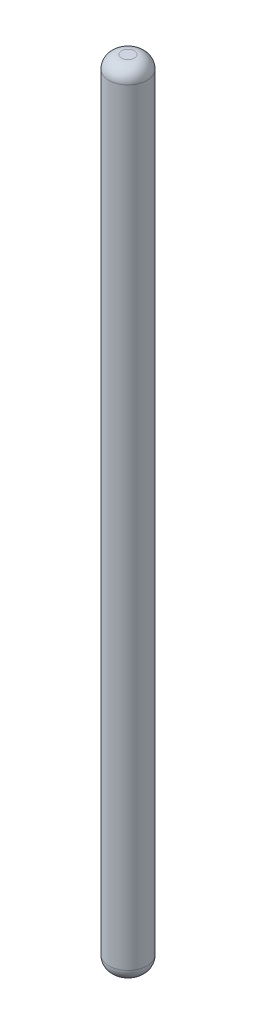
ISO-10303-21;
HEADER;
FILE_DESCRIPTION(('STEP AP214'),'2;1');
FILE_NAME('part.step','',(''),(''),'','','');
FILE_SCHEMA(('AUTOMOTIVE_DESIGN { 1 0 10303 214 1 1 1 1 }'));
ENDSEC;
DATA;
#1=APPLICATION_CONTEXT('core data for automotive mechanical design processes');
#2=APPLICATION_PROTOCOL_DEFINITION('international standard','automotive_design',2000,#1);
#3=PRODUCT_CONTEXT('',#1,'mechanical');
#4=PRODUCT('Part','Part','',(#3));
#5=PRODUCT_RELATED_PRODUCT_CATEGORY('part','',(#4));
#6=PRODUCT_DEFINITION_FORMATION('','',#4);
#7=PRODUCT_DEFINITION_CONTEXT('part definition',#1,'design');
#8=PRODUCT_DEFINITION('design','',#6,#7);
#9=PRODUCT_DEFINITION_SHAPE('','',#8);
#10=(LENGTH_UNIT() NAMED_UNIT(*) SI_UNIT(.MILLI.,.METRE.));
#11=(NAMED_UNIT(*) PLANE_ANGLE_UNIT() SI_UNIT($,.RADIAN.));
#12=(NAMED_UNIT(*) SI_UNIT($,.STERADIAN.) SOLID_ANGLE_UNIT());
#13=UNCERTAINTY_MEASURE_WITH_UNIT(LENGTH_MEASURE(1.E-05),#10,'distance_accuracy_value','');
#14=(GEOMETRIC_REPRESENTATION_CONTEXT(3) GLOBAL_UNCERTAINTY_ASSIGNED_CONTEXT((#13)) GLOBAL_UNIT_ASSIGNED_CONTEXT((#10,
#11,#12)) REPRESENTATION_CONTEXT('',''));
#15=CARTESIAN_POINT('',(0.,0.,0.));
#16=DIRECTION('',(0.,0.,1.));
#17=DIRECTION('',(1.,0.,0.));
#18=AXIS2_PLACEMENT_3D('',#15,#16,#17);
#19=CARTESIAN_POINT('',(0.,62.,0.));
#20=DIRECTION('',(0.,-1.,0.));
#21=DIRECTION('',(0.,0.,-1.));
#22=AXIS2_PLACEMENT_3D('',#19,#20,#21);
#23=CYLINDRICAL_SURFACE('',#22,1.5);
#24=CARTESIAN_POINT('',(0.,1.,0.));
#25=DIRECTION('',(0.,1.,0.));
#26=DIRECTION('',(0.,0.,1.));
#27=AXIS2_PLACEMENT_3D('',#24,#25,#26);
#28=CIRCLE('',#27,1.5);
#29=CARTESIAN_POINT('',(0.,1.,1.5));
#30=VERTEX_POINT('',#29);
#31=EDGE_CURVE('E43',#30,#30,#28,.T.);
#32=ORIENTED_EDGE('',*,*,#31,.T.);
#33=EDGE_LOOP('',(#32));
#34=FACE_BOUND('',#33,.T.);
#35=CARTESIAN_POINT('',(0.,61.,0.));
#36=DIRECTION('',(0.,1.,0.));
#37=DIRECTION('',(0.,0.,1.));
#38=AXIS2_PLACEMENT_3D('',#35,#36,#37);
#39=CIRCLE('',#38,1.5);
#40=CARTESIAN_POINT('',(0.,61.,1.5));
#41=VERTEX_POINT('',#40);
#42=EDGE_CURVE('E47',#41,#41,#39,.F.);
#43=ORIENTED_EDGE('',*,*,#42,.T.);
#44=EDGE_LOOP('',(#43));
#45=FACE_BOUND('',#44,.T.);
#46=ADVANCED_FACE('F32',(#34,#45),#23,.T.);
#47=CARTESIAN_POINT('',(0.,62.,0.));
#48=DIRECTION('',(0.,1.,0.));
#49=DIRECTION('',(0.,0.,1.));
#50=AXIS2_PLACEMENT_3D('',#47,#48,#49);
#51=PLANE('',#50);
#52=CARTESIAN_POINT('',(0.,62.,0.));
#53=DIRECTION('',(0.,1.,0.));
#54=DIRECTION('',(0.,0.,1.));
#55=AXIS2_PLACEMENT_3D('',#52,#53,#54);
#56=CIRCLE('',#55,0.5);
#57=CARTESIAN_POINT('',(0.,62.,0.5));
#58=VERTEX_POINT('',#57);
#59=EDGE_CURVE('E10',#58,#58,#56,.T.);
#60=ORIENTED_EDGE('',*,*,#59,.T.);
#61=EDGE_LOOP('',(#60));
#62=FACE_BOUND('',#61,.T.);
#63=ADVANCED_FACE('F63',(#62),#51,.T.);
#64=CARTESIAN_POINT('',(0.,0.,0.));
#65=DIRECTION('',(0.,1.,0.));
#66=DIRECTION('',(0.,0.,1.));
#67=AXIS2_PLACEMENT_3D('',#64,#65,#66);
#68=PLANE('',#67);
#69=CARTESIAN_POINT('',(0.,0.,0.));
#70=DIRECTION('',(0.,1.,0.));
#71=DIRECTION('',(0.,0.,1.));
#72=AXIS2_PLACEMENT_3D('',#69,#70,#71);
#73=CIRCLE('',#72,0.5);
#74=CARTESIAN_POINT('',(0.,0.,0.5));
#75=VERTEX_POINT('',#74);
#76=EDGE_CURVE('E39',#75,#75,#73,.F.);
#77=ORIENTED_EDGE('',*,*,#76,.T.);
#78=EDGE_LOOP('',(#77));
#79=FACE_BOUND('',#78,.T.);
#80=ADVANCED_FACE('F60',(#79),#68,.F.);
#81=CARTESIAN_POINT('',(0.,1.,0.));
#82=DIRECTION('',(0.,1.,0.));
#83=DIRECTION('',(0.,0.,1.));
#84=AXIS2_PLACEMENT_3D('',#81,#82,#83);
#85=DEGENERATE_TOROIDAL_SURFACE('',#84,0.5,1.,.T.);
#86=ORIENTED_EDGE('',*,*,#76,.F.);
#87=EDGE_LOOP('',(#86));
#88=FACE_BOUND('',#87,.T.);
#89=ORIENTED_EDGE('',*,*,#31,.F.);
#90=EDGE_LOOP('',(#89));
#91=FACE_BOUND('',#90,.T.);
#92=ADVANCED_FACE('F56',(#88,#91),#85,.T.);
#93=CARTESIAN_POINT('',(0.,61.,0.));
#94=DIRECTION('',(0.,1.,0.));
#95=DIRECTION('',(0.,0.,1.));
#96=AXIS2_PLACEMENT_3D('',#93,#94,#95);
#97=DEGENERATE_TOROIDAL_SURFACE('',#96,0.5,1.,.T.);
#98=ORIENTED_EDGE('',*,*,#42,.F.);
#99=EDGE_LOOP('',(#98));
#100=FACE_BOUND('',#99,.T.);
#101=ORIENTED_EDGE('',*,*,#59,.F.);
#102=EDGE_LOOP('',(#101));
#103=FACE_BOUND('',#102,.T.);
#104=ADVANCED_FACE('F34',(#100,#103),#97,.T.);
#105=CLOSED_SHELL('',(#46,#63,#80,#92,#104));
#106=MANIFOLD_SOLID_BREP('B2',#105);
#107=ADVANCED_BREP_SHAPE_REPRESENTATION('',(#18,#106),#14);
#108=SHAPE_DEFINITION_REPRESENTATION(#9,#107);
ENDSEC;
END-ISO-10303-21;
